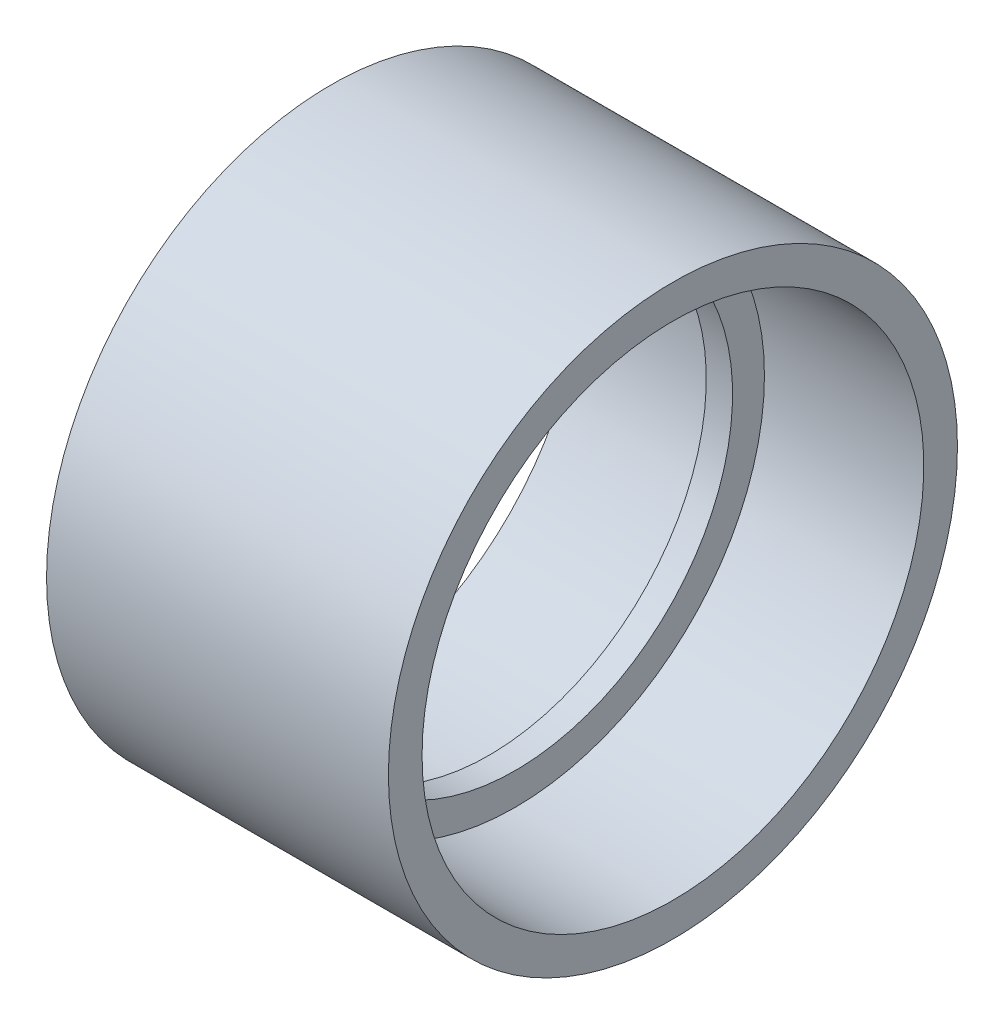
ISO-10303-21;
HEADER;
FILE_DESCRIPTION(('STEP AP214'),'2;1');
FILE_NAME('part.step','',(''),(''),'','','');
FILE_SCHEMA(('AUTOMOTIVE_DESIGN { 1 0 10303 214 1 1 1 1 }'));
ENDSEC;
DATA;
#1=APPLICATION_CONTEXT('core data for automotive mechanical design processes');
#2=APPLICATION_PROTOCOL_DEFINITION('international standard','automotive_design',2000,#1);
#3=PRODUCT_CONTEXT('',#1,'mechanical');
#4=PRODUCT('Part','Part','',(#3));
#5=PRODUCT_RELATED_PRODUCT_CATEGORY('part','',(#4));
#6=PRODUCT_DEFINITION_FORMATION('','',#4);
#7=PRODUCT_DEFINITION_CONTEXT('part definition',#1,'design');
#8=PRODUCT_DEFINITION('design','',#6,#7);
#9=PRODUCT_DEFINITION_SHAPE('','',#8);
#10=(LENGTH_UNIT() NAMED_UNIT(*) SI_UNIT(.MILLI.,.METRE.));
#11=(NAMED_UNIT(*) PLANE_ANGLE_UNIT() SI_UNIT($,.RADIAN.));
#12=(NAMED_UNIT(*) SI_UNIT($,.STERADIAN.) SOLID_ANGLE_UNIT());
#13=UNCERTAINTY_MEASURE_WITH_UNIT(LENGTH_MEASURE(1.E-05),#10,'distance_accuracy_value','');
#14=(GEOMETRIC_REPRESENTATION_CONTEXT(3) GLOBAL_UNCERTAINTY_ASSIGNED_CONTEXT((#13)) GLOBAL_UNIT_ASSIGNED_CONTEXT((#10,
#11,#12)) REPRESENTATION_CONTEXT('',''));
#15=CARTESIAN_POINT('',(0.,0.,0.));
#16=DIRECTION('',(0.,0.,1.));
#17=DIRECTION('',(1.,0.,0.));
#18=AXIS2_PLACEMENT_3D('',#15,#16,#17);
#19=CARTESIAN_POINT('',(-20.6375,-34.3535,0.));
#20=DIRECTION('',(-1.,0.,0.));
#21=DIRECTION('',(0.,0.,1.));
#22=AXIS2_PLACEMENT_3D('',#19,#20,#21);
#23=PLANE('',#22);
#24=CARTESIAN_POINT('',(-20.6375,0.,0.));
#25=DIRECTION('',(-1.,0.,0.));
#26=DIRECTION('',(0.,0.,1.));
#27=AXIS2_PLACEMENT_3D('',#24,#25,#26);
#28=CIRCLE('',#27,34.3535);
#29=CARTESIAN_POINT('',(-20.6375,0.,34.3535));
#30=VERTEX_POINT('',#29);
#31=EDGE_CURVE('E66',#30,#30,#28,.T.);
#32=ORIENTED_EDGE('',*,*,#31,.T.);
#33=EDGE_LOOP('',(#32));
#34=FACE_BOUND('',#33,.T.);
#35=CARTESIAN_POINT('',(-20.6375,0.,0.));
#36=DIRECTION('',(-1.,0.,0.));
#37=DIRECTION('',(0.,0.,1.));
#38=AXIS2_PLACEMENT_3D('',#35,#36,#37);
#39=CIRCLE('',#38,30.2895);
#40=CARTESIAN_POINT('',(-20.6375,0.,30.2895));
#41=VERTEX_POINT('',#40);
#42=EDGE_CURVE('E10',#41,#41,#39,.T.);
#43=ORIENTED_EDGE('',*,*,#42,.F.);
#44=EDGE_LOOP('',(#43));
#45=FACE_BOUND('',#44,.T.);
#46=ADVANCED_FACE('F32',(#34,#45),#23,.T.);
#47=CARTESIAN_POINT('',(-1.5875,0.,0.));
#48=DIRECTION('',(-1.,0.,0.));
#49=DIRECTION('',(0.,0.,1.));
#50=AXIS2_PLACEMENT_3D('',#47,#48,#49);
#51=CONICAL_SURFACE('',#50,30.099,0.00999966668666504);
#52=ORIENTED_EDGE('',*,*,#42,.T.);
#53=EDGE_LOOP('',(#52));
#54=FACE_BOUND('',#53,.T.);
#55=CARTESIAN_POINT('',(-1.5875,0.,0.));
#56=DIRECTION('',(-1.,0.,0.));
#57=DIRECTION('',(0.,0.,1.));
#58=AXIS2_PLACEMENT_3D('',#55,#56,#57);
#59=CIRCLE('',#58,30.099);
#60=CARTESIAN_POINT('',(-1.5875,0.,30.099));
#61=VERTEX_POINT('',#60);
#62=EDGE_CURVE('E39',#61,#61,#59,.T.);
#63=ORIENTED_EDGE('',*,*,#62,.F.);
#64=EDGE_LOOP('',(#63));
#65=FACE_BOUND('',#64,.T.);
#66=ADVANCED_FACE('F85',(#54,#65),#51,.F.);
#67=CARTESIAN_POINT('',(-1.5875,-26.2509,0.));
#68=DIRECTION('',(-1.,0.,0.));
#69=DIRECTION('',(0.,0.,1.));
#70=AXIS2_PLACEMENT_3D('',#67,#68,#69);
#71=PLANE('',#70);
#72=ORIENTED_EDGE('',*,*,#62,.T.);
#73=EDGE_LOOP('',(#72));
#74=FACE_BOUND('',#73,.T.);
#75=CARTESIAN_POINT('',(-1.5875,0.,0.));
#76=DIRECTION('',(-1.,0.,0.));
#77=DIRECTION('',(0.,0.,1.));
#78=AXIS2_PLACEMENT_3D('',#75,#76,#77);
#79=CIRCLE('',#78,26.2509);
#80=CARTESIAN_POINT('',(-1.5875,0.,26.2509));
#81=VERTEX_POINT('',#80);
#82=EDGE_CURVE('E46',#81,#81,#79,.T.);
#83=ORIENTED_EDGE('',*,*,#82,.F.);
#84=EDGE_LOOP('',(#83));
#85=FACE_BOUND('',#84,.T.);
#86=ADVANCED_FACE('F89',(#74,#85),#71,.T.);
#87=CARTESIAN_POINT('',(-20.6375,0.,0.));
#88=DIRECTION('',(-1.,0.,0.));
#89=DIRECTION('',(0.,0.,1.));
#90=AXIS2_PLACEMENT_3D('',#87,#88,#89);
#91=CYLINDRICAL_SURFACE('',#90,26.2509);
#92=ORIENTED_EDGE('',*,*,#82,.T.);
#93=EDGE_LOOP('',(#92));
#94=FACE_BOUND('',#93,.T.);
#95=CARTESIAN_POINT('',(1.5875,0.,0.));
#96=DIRECTION('',(-1.,0.,0.));
#97=DIRECTION('',(0.,0.,1.));
#98=AXIS2_PLACEMENT_3D('',#95,#96,#97);
#99=CIRCLE('',#98,26.2509);
#100=CARTESIAN_POINT('',(1.5875,0.,26.2509));
#101=VERTEX_POINT('',#100);
#102=EDGE_CURVE('E50',#101,#101,#99,.T.);
#103=ORIENTED_EDGE('',*,*,#102,.F.);
#104=EDGE_LOOP('',(#103));
#105=FACE_BOUND('',#104,.T.);
#106=ADVANCED_FACE('F93',(#94,#105),#91,.F.);
#107=CARTESIAN_POINT('',(1.5875,-26.2509,0.));
#108=DIRECTION('',(1.,0.,0.));
#109=DIRECTION('',(0.,0.,-1.));
#110=AXIS2_PLACEMENT_3D('',#107,#108,#109);
#111=PLANE('',#110);
#112=ORIENTED_EDGE('',*,*,#102,.T.);
#113=EDGE_LOOP('',(#112));
#114=FACE_BOUND('',#113,.T.);
#115=CARTESIAN_POINT('',(1.5875,0.,0.));
#116=DIRECTION('',(-1.,0.,0.));
#117=DIRECTION('',(0.,0.,1.));
#118=AXIS2_PLACEMENT_3D('',#115,#116,#117);
#119=CIRCLE('',#118,30.099);
#120=CARTESIAN_POINT('',(1.5875,0.,30.099));
#121=VERTEX_POINT('',#120);
#122=EDGE_CURVE('E55',#121,#121,#119,.T.);
#123=ORIENTED_EDGE('',*,*,#122,.F.);
#124=EDGE_LOOP('',(#123));
#125=FACE_BOUND('',#124,.T.);
#126=ADVANCED_FACE('F99',(#114,#125),#111,.T.);
#127=CARTESIAN_POINT('',(20.6375,0.,0.));
#128=DIRECTION('',(1.,0.,0.));
#129=DIRECTION('',(0.,0.,-1.));
#130=AXIS2_PLACEMENT_3D('',#127,#128,#129);
#131=CONICAL_SURFACE('',#130,30.2895,0.00999966668666486);
#132=ORIENTED_EDGE('',*,*,#122,.T.);
#133=EDGE_LOOP('',(#132));
#134=FACE_BOUND('',#133,.T.);
#135=CARTESIAN_POINT('',(20.6375,0.,0.));
#136=DIRECTION('',(-1.,0.,0.));
#137=DIRECTION('',(0.,0.,1.));
#138=AXIS2_PLACEMENT_3D('',#135,#136,#137);
#139=CIRCLE('',#138,30.2895);
#140=CARTESIAN_POINT('',(20.6375,0.,30.2895));
#141=VERTEX_POINT('',#140);
#142=EDGE_CURVE('E59',#141,#141,#139,.T.);
#143=ORIENTED_EDGE('',*,*,#142,.F.);
#144=EDGE_LOOP('',(#143));
#145=FACE_BOUND('',#144,.T.);
#146=ADVANCED_FACE('F81',(#134,#145),#131,.F.);
#147=CARTESIAN_POINT('',(20.6375,-34.3535,0.));
#148=DIRECTION('',(1.,0.,0.));
#149=DIRECTION('',(0.,0.,-1.));
#150=AXIS2_PLACEMENT_3D('',#147,#148,#149);
#151=PLANE('',#150);
#152=ORIENTED_EDGE('',*,*,#142,.T.);
#153=EDGE_LOOP('',(#152));
#154=FACE_BOUND('',#153,.T.);
#155=CARTESIAN_POINT('',(20.6375,0.,0.));
#156=DIRECTION('',(-1.,0.,0.));
#157=DIRECTION('',(0.,0.,1.));
#158=AXIS2_PLACEMENT_3D('',#155,#156,#157);
#159=CIRCLE('',#158,34.3535);
#160=CARTESIAN_POINT('',(20.6375,0.,34.3535));
#161=VERTEX_POINT('',#160);
#162=EDGE_CURVE('E63',#161,#161,#159,.T.);
#163=ORIENTED_EDGE('',*,*,#162,.F.);
#164=EDGE_LOOP('',(#163));
#165=FACE_BOUND('',#164,.T.);
#166=ADVANCED_FACE('F76',(#154,#165),#151,.T.);
#167=CARTESIAN_POINT('',(-20.6375,0.,0.));
#168=DIRECTION('',(-1.,0.,0.));
#169=DIRECTION('',(0.,0.,1.));
#170=AXIS2_PLACEMENT_3D('',#167,#168,#169);
#171=CYLINDRICAL_SURFACE('',#170,34.3535);
#172=ORIENTED_EDGE('',*,*,#162,.T.);
#173=EDGE_LOOP('',(#172));
#174=FACE_BOUND('',#173,.T.);
#175=ORIENTED_EDGE('',*,*,#31,.F.);
#176=EDGE_LOOP('',(#175));
#177=FACE_BOUND('',#176,.T.);
#178=ADVANCED_FACE('F74',(#174,#177),#171,.T.);
#179=CLOSED_SHELL('',(#46,#66,#86,#106,#126,#146,#166,#178));
#180=MANIFOLD_SOLID_BREP('B2',#179);
#181=ADVANCED_BREP_SHAPE_REPRESENTATION('',(#18,#180),#14);
#182=SHAPE_DEFINITION_REPRESENTATION(#9,#181);
ENDSEC;
END-ISO-10303-21;
